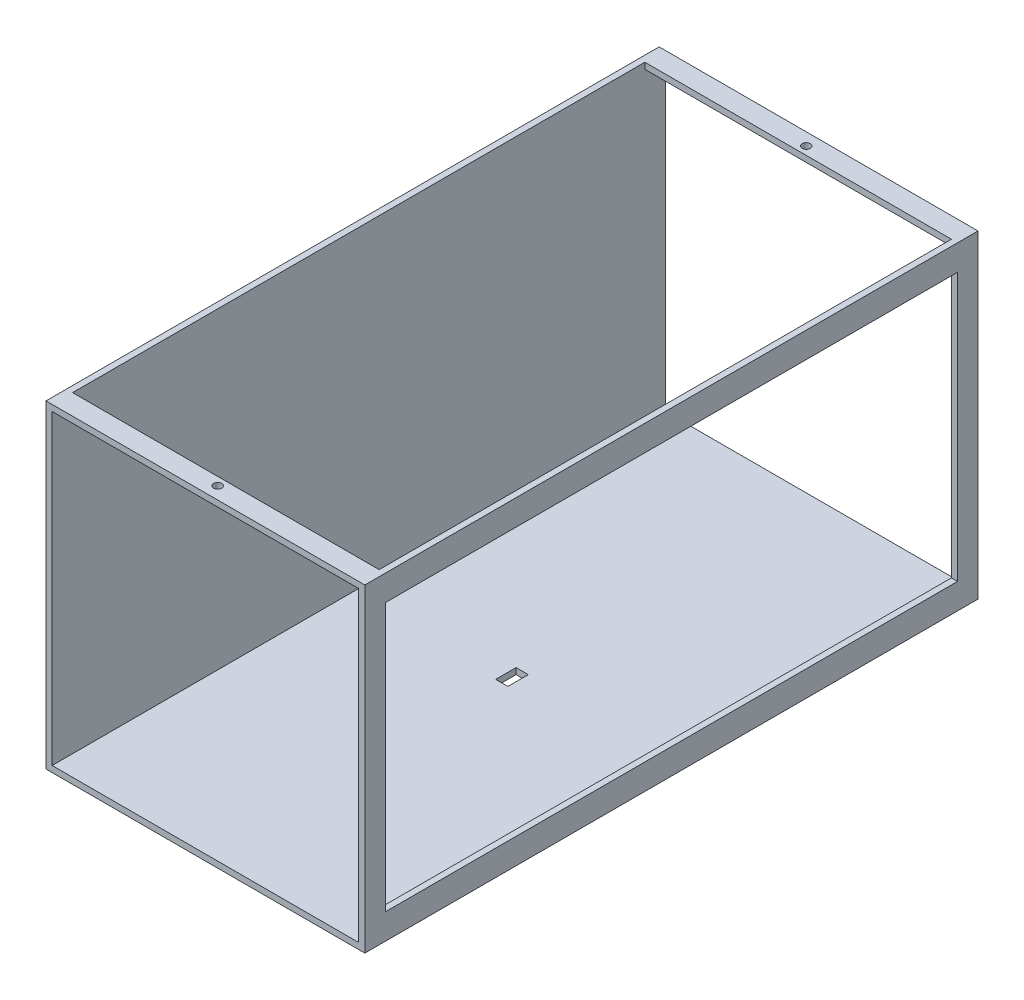
ISO-10303-21;
HEADER;
FILE_DESCRIPTION(('STEP AP214'),'2;1');
FILE_NAME('part.step','',(''),(''),'','','');
FILE_SCHEMA(('AUTOMOTIVE_DESIGN { 1 0 10303 214 1 1 1 1 }'));
ENDSEC;
DATA;
#1=APPLICATION_CONTEXT('core data for automotive mechanical design processes');
#2=APPLICATION_PROTOCOL_DEFINITION('international standard','automotive_design',2000,#1);
#3=PRODUCT_CONTEXT('',#1,'mechanical');
#4=PRODUCT('Part','Part','',(#3));
#5=PRODUCT_RELATED_PRODUCT_CATEGORY('part','',(#4));
#6=PRODUCT_DEFINITION_FORMATION('','',#4);
#7=PRODUCT_DEFINITION_CONTEXT('part definition',#1,'design');
#8=PRODUCT_DEFINITION('design','',#6,#7);
#9=PRODUCT_DEFINITION_SHAPE('','',#8);
#10=(LENGTH_UNIT() NAMED_UNIT(*) SI_UNIT(.MILLI.,.METRE.));
#11=(NAMED_UNIT(*) PLANE_ANGLE_UNIT() SI_UNIT($,.RADIAN.));
#12=(NAMED_UNIT(*) SI_UNIT($,.STERADIAN.) SOLID_ANGLE_UNIT());
#13=UNCERTAINTY_MEASURE_WITH_UNIT(LENGTH_MEASURE(1.E-05),#10,'distance_accuracy_value','');
#14=(GEOMETRIC_REPRESENTATION_CONTEXT(3) GLOBAL_UNCERTAINTY_ASSIGNED_CONTEXT((#13)) GLOBAL_UNIT_ASSIGNED_CONTEXT((#10,
#11,#12)) REPRESENTATION_CONTEXT('',''));
#15=CARTESIAN_POINT('',(0.,0.,0.));
#16=DIRECTION('',(0.,0.,1.));
#17=DIRECTION('',(1.,0.,0.));
#18=AXIS2_PLACEMENT_3D('',#15,#16,#17);
#19=CARTESIAN_POINT('',(75.,75.,300.));
#20=DIRECTION('',(-1.,0.,0.));
#21=DIRECTION('',(0.,-1.,0.));
#22=AXIS2_PLACEMENT_3D('',#19,#20,#21);
#23=PLANE('',#22);
#24=DIRECTION('',(0.,0.,-1.));
#25=VECTOR('',#24,1.);
#26=CARTESIAN_POINT('',(75.,65.5,300.));
#27=LINE('',#26,#25);
#28=CARTESIAN_POINT('',(75.,65.5,290.));
#29=VERTEX_POINT('',#28);
#30=CARTESIAN_POINT('',(75.,65.5,9.99999999999995));
#31=VERTEX_POINT('',#30);
#32=EDGE_CURVE('E411',#29,#31,#27,.T.);
#33=ORIENTED_EDGE('',*,*,#32,.F.);
#34=DIRECTION('',(0.,1.,0.));
#35=VECTOR('',#34,1.);
#36=CARTESIAN_POINT('',(75.,75.,290.));
#37=LINE('',#36,#35);
#38=CARTESIAN_POINT('',(75.,-65.5,290.));
#39=VERTEX_POINT('',#38);
#40=EDGE_CURVE('E414',#39,#29,#37,.T.);
#41=ORIENTED_EDGE('',*,*,#40,.F.);
#42=DIRECTION('',(0.,0.,1.));
#43=VECTOR('',#42,1.);
#44=CARTESIAN_POINT('',(75.,-65.5,300.));
#45=LINE('',#44,#43);
#46=CARTESIAN_POINT('',(75.,-65.5,9.99999999999995));
#47=VERTEX_POINT('',#46);
#48=EDGE_CURVE('E404',#47,#39,#45,.T.);
#49=ORIENTED_EDGE('',*,*,#48,.F.);
#50=DIRECTION('',(0.,-1.,0.));
#51=VECTOR('',#50,1.);
#52=CARTESIAN_POINT('',(75.,75.,9.99999999999995));
#53=LINE('',#52,#51);
#54=EDGE_CURVE('E407',#31,#47,#53,.T.);
#55=ORIENTED_EDGE('',*,*,#54,.F.);
#56=EDGE_LOOP('',(#33,#41,#49,#55));
#57=FACE_BOUND('',#56,.T.);
#58=DIRECTION('',(0.,1.,0.));
#59=VECTOR('',#58,1.);
#60=CARTESIAN_POINT('',(75.,75.,300.));
#61=LINE('',#60,#59);
#62=CARTESIAN_POINT('',(75.,-75.,300.));
#63=VERTEX_POINT('',#62);
#64=CARTESIAN_POINT('',(75.,75.,300.));
#65=VERTEX_POINT('',#64);
#66=EDGE_CURVE('E207',#63,#65,#61,.T.);
#67=ORIENTED_EDGE('',*,*,#66,.T.);
#68=DIRECTION('',(0.,0.,1.));
#69=VECTOR('',#68,1.);
#70=CARTESIAN_POINT('',(75.,75.,-43.0000000000001));
#71=LINE('',#70,#69);
#72=CARTESIAN_POINT('',(75.0000000000001,75.,290.));
#73=VERTEX_POINT('',#72);
#74=EDGE_CURVE('E86',#73,#65,#71,.T.);
#75=ORIENTED_EDGE('',*,*,#74,.F.);
#76=DIRECTION('',(0.,1.,0.));
#77=VECTOR('',#76,1.);
#78=CARTESIAN_POINT('',(75.0000000000001,78.,290.));
#79=LINE('',#78,#77);
#80=CARTESIAN_POINT('',(75.0000000000001,78.,290.));
#81=VERTEX_POINT('',#80);
#82=EDGE_CURVE('E298',#73,#81,#79,.T.);
#83=ORIENTED_EDGE('',*,*,#82,.T.);
#84=DIRECTION('',(0.,0.,-1.));
#85=VECTOR('',#84,1.);
#86=CARTESIAN_POINT('',(75.,78.,300.));
#87=LINE('',#86,#85);
#88=CARTESIAN_POINT('',(75.,78.,9.99999999999995));
#89=VERTEX_POINT('',#88);
#90=EDGE_CURVE('E311',#81,#89,#87,.T.);
#91=ORIENTED_EDGE('',*,*,#90,.T.);
#92=DIRECTION('',(0.,-1.,0.));
#93=VECTOR('',#92,1.);
#94=CARTESIAN_POINT('',(75.0000000000001,65.5,9.99999999999995));
#95=LINE('',#94,#93);
#96=CARTESIAN_POINT('',(75.,75.,9.99999999999995));
#97=VERTEX_POINT('',#96);
#98=EDGE_CURVE('E286',#89,#97,#95,.T.);
#99=ORIENTED_EDGE('',*,*,#98,.T.);
#100=CARTESIAN_POINT('',(75.,75.,0.));
#101=VERTEX_POINT('',#100);
#102=EDGE_CURVE('E225',#101,#97,#71,.T.);
#103=ORIENTED_EDGE('',*,*,#102,.F.);
#104=DIRECTION('',(0.,1.,0.));
#105=VECTOR('',#104,1.);
#106=CARTESIAN_POINT('',(75.,75.,0.));
#107=LINE('',#106,#105);
#108=CARTESIAN_POINT('',(75.,-75.,0.));
#109=VERTEX_POINT('',#108);
#110=EDGE_CURVE('E333',#109,#101,#107,.T.);
#111=ORIENTED_EDGE('',*,*,#110,.F.);
#112=DIRECTION('',(0.,0.,-1.));
#113=VECTOR('',#112,1.);
#114=CARTESIAN_POINT('',(75.,-75.,300.));
#115=LINE('',#114,#113);
#116=EDGE_CURVE('E209',#63,#109,#115,.T.);
#117=ORIENTED_EDGE('',*,*,#116,.F.);
#118=EDGE_LOOP('',(#67,#75,#83,#91,#99,#103,#111,#117));
#119=FACE_BOUND('',#118,.T.);
#120=ADVANCED_FACE('F69',(#57,#119),#23,.T.);
#121=CARTESIAN_POINT('',(-75.,75.,300.));
#122=DIRECTION('',(1.,0.,0.));
#123=DIRECTION('',(0.,1.,0.));
#124=AXIS2_PLACEMENT_3D('',#121,#122,#123);
#125=PLANE('',#124);
#126=DIRECTION('',(0.,0.,1.));
#127=VECTOR('',#126,1.);
#128=CARTESIAN_POINT('',(-75.,75.,-43.0000000000001));
#129=LINE('',#128,#127);
#130=CARTESIAN_POINT('',(-75.,75.,290.));
#131=VERTEX_POINT('',#130);
#132=CARTESIAN_POINT('',(-75.,75.,300.));
#133=VERTEX_POINT('',#132);
#134=EDGE_CURVE('E233',#131,#133,#129,.T.);
#135=ORIENTED_EDGE('',*,*,#134,.T.);
#136=DIRECTION('',(0.,-1.,0.));
#137=VECTOR('',#136,1.);
#138=CARTESIAN_POINT('',(-75.,75.,300.));
#139=LINE('',#138,#137);
#140=CARTESIAN_POINT('',(-75.,-75.,300.));
#141=VERTEX_POINT('',#140);
#142=EDGE_CURVE('E214',#133,#141,#139,.T.);
#143=ORIENTED_EDGE('',*,*,#142,.T.);
#144=DIRECTION('',(0.,0.,-1.));
#145=VECTOR('',#144,1.);
#146=CARTESIAN_POINT('',(-75.,-75.,300.));
#147=LINE('',#146,#145);
#148=CARTESIAN_POINT('',(-75.,-75.,0.));
#149=VERTEX_POINT('',#148);
#150=EDGE_CURVE('E358',#141,#149,#147,.T.);
#151=ORIENTED_EDGE('',*,*,#150,.T.);
#152=DIRECTION('',(0.,-1.,0.));
#153=VECTOR('',#152,1.);
#154=CARTESIAN_POINT('',(-75.,75.,0.));
#155=LINE('',#154,#153);
#156=CARTESIAN_POINT('',(-75.,75.,0.));
#157=VERTEX_POINT('',#156);
#158=EDGE_CURVE('E350',#157,#149,#155,.T.);
#159=ORIENTED_EDGE('',*,*,#158,.F.);
#160=CARTESIAN_POINT('',(-75.,75.,9.99999999999995));
#161=VERTEX_POINT('',#160);
#162=EDGE_CURVE('E235',#157,#161,#129,.T.);
#163=ORIENTED_EDGE('',*,*,#162,.T.);
#164=DIRECTION('',(0.,-1.,0.));
#165=VECTOR('',#164,1.);
#166=CARTESIAN_POINT('',(-75.,65.5,9.99999999999995));
#167=LINE('',#166,#165);
#168=CARTESIAN_POINT('',(-75.,78.,9.99999999999995));
#169=VERTEX_POINT('',#168);
#170=EDGE_CURVE('E285',#169,#161,#167,.T.);
#171=ORIENTED_EDGE('',*,*,#170,.F.);
#172=DIRECTION('',(0.,0.,1.));
#173=VECTOR('',#172,1.);
#174=CARTESIAN_POINT('',(-75.,78.,300.));
#175=LINE('',#174,#173);
#176=CARTESIAN_POINT('',(-75.,78.,290.));
#177=VERTEX_POINT('',#176);
#178=EDGE_CURVE('E307',#169,#177,#175,.T.);
#179=ORIENTED_EDGE('',*,*,#178,.T.);
#180=DIRECTION('',(0.,1.,0.));
#181=VECTOR('',#180,1.);
#182=CARTESIAN_POINT('',(-75.,78.,290.));
#183=LINE('',#182,#181);
#184=EDGE_CURVE('E297',#131,#177,#183,.T.);
#185=ORIENTED_EDGE('',*,*,#184,.F.);
#186=EDGE_LOOP('',(#135,#143,#151,#159,#163,#171,#179,#185));
#187=FACE_BOUND('',#186,.T.);
#188=ADVANCED_FACE('F475',(#187),#125,.T.);
#189=CARTESIAN_POINT('',(0.,0.,300.));
#190=DIRECTION('',(0.,0.,1.));
#191=DIRECTION('',(1.,0.,0.));
#192=AXIS2_PLACEMENT_3D('',#189,#190,#191);
#193=PLANE('',#192);
#194=ORIENTED_EDGE('',*,*,#142,.F.);
#195=DIRECTION('',(-1.,0.,0.));
#196=VECTOR('',#195,1.);
#197=CARTESIAN_POINT('',(-75.,75.,300.));
#198=LINE('',#197,#196);
#199=EDGE_CURVE('E220',#65,#133,#198,.T.);
#200=ORIENTED_EDGE('',*,*,#199,.F.);
#201=ORIENTED_EDGE('',*,*,#66,.F.);
#202=DIRECTION('',(1.,0.,0.));
#203=VECTOR('',#202,1.);
#204=CARTESIAN_POINT('',(-75.,-75.,300.));
#205=LINE('',#204,#203);
#206=EDGE_CURVE('E345',#141,#63,#205,.T.);
#207=ORIENTED_EDGE('',*,*,#206,.F.);
#208=EDGE_LOOP('',(#194,#200,#201,#207));
#209=FACE_BOUND('',#208,.T.);
#210=DIRECTION('',(-1.,0.,0.));
#211=VECTOR('',#210,1.);
#212=CARTESIAN_POINT('',(-75.,78.,300.));
#213=LINE('',#212,#211);
#214=CARTESIAN_POINT('',(78.,78.,300.));
#215=VERTEX_POINT('',#214);
#216=CARTESIAN_POINT('',(-78.,78.,300.));
#217=VERTEX_POINT('',#216);
#218=EDGE_CURVE('E367',#215,#217,#213,.T.);
#219=ORIENTED_EDGE('',*,*,#218,.T.);
#220=DIRECTION('',(0.,-1.,0.));
#221=VECTOR('',#220,1.);
#222=CARTESIAN_POINT('',(-78.,75.,300.));
#223=LINE('',#222,#221);
#224=CARTESIAN_POINT('',(-78.,-78.,300.));
#225=VERTEX_POINT('',#224);
#226=EDGE_CURVE('E371',#217,#225,#223,.T.);
#227=ORIENTED_EDGE('',*,*,#226,.T.);
#228=DIRECTION('',(1.,0.,0.));
#229=VECTOR('',#228,1.);
#230=CARTESIAN_POINT('',(-75.,-78.,300.));
#231=LINE('',#230,#229);
#232=CARTESIAN_POINT('',(78.,-78.,300.));
#233=VERTEX_POINT('',#232);
#234=EDGE_CURVE('E374',#225,#233,#231,.T.);
#235=ORIENTED_EDGE('',*,*,#234,.T.);
#236=DIRECTION('',(0.,1.,0.));
#237=VECTOR('',#236,1.);
#238=CARTESIAN_POINT('',(78.,75.,300.));
#239=LINE('',#238,#237);
#240=EDGE_CURVE('E363',#233,#215,#239,.T.);
#241=ORIENTED_EDGE('',*,*,#240,.T.);
#242=EDGE_LOOP('',(#219,#227,#235,#241));
#243=FACE_BOUND('',#242,.T.);
#244=ADVANCED_FACE('F227',(#209,#243),#193,.T.);
#245=CARTESIAN_POINT('',(0.,0.,0.));
#246=DIRECTION('',(0.,0.,1.));
#247=DIRECTION('',(1.,0.,0.));
#248=AXIS2_PLACEMENT_3D('',#245,#246,#247);
#249=PLANE('',#248);
#250=DIRECTION('',(0.,-1.,0.));
#251=VECTOR('',#250,1.);
#252=CARTESIAN_POINT('',(-78.,75.,0.));
#253=LINE('',#252,#251);
#254=CARTESIAN_POINT('',(-78.,78.,0.));
#255=VERTEX_POINT('',#254);
#256=CARTESIAN_POINT('',(-78.,-78.,0.));
#257=VERTEX_POINT('',#256);
#258=EDGE_CURVE('E384',#255,#257,#253,.T.);
#259=ORIENTED_EDGE('',*,*,#258,.F.);
#260=DIRECTION('',(-1.,0.,0.));
#261=VECTOR('',#260,1.);
#262=CARTESIAN_POINT('',(-75.,78.,0.));
#263=LINE('',#262,#261);
#264=CARTESIAN_POINT('',(78.,78.,0.));
#265=VERTEX_POINT('',#264);
#266=EDGE_CURVE('E381',#265,#255,#263,.T.);
#267=ORIENTED_EDGE('',*,*,#266,.F.);
#268=DIRECTION('',(0.,1.,0.));
#269=VECTOR('',#268,1.);
#270=CARTESIAN_POINT('',(78.,75.,0.));
#271=LINE('',#270,#269);
#272=CARTESIAN_POINT('',(78.,-78.,0.));
#273=VERTEX_POINT('',#272);
#274=EDGE_CURVE('E362',#273,#265,#271,.T.);
#275=ORIENTED_EDGE('',*,*,#274,.F.);
#276=DIRECTION('',(1.,0.,0.));
#277=VECTOR('',#276,1.);
#278=CARTESIAN_POINT('',(-75.,-78.,0.));
#279=LINE('',#278,#277);
#280=EDGE_CURVE('E368',#257,#273,#279,.T.);
#281=ORIENTED_EDGE('',*,*,#280,.F.);
#282=EDGE_LOOP('',(#259,#267,#275,#281));
#283=FACE_BOUND('',#282,.T.);
#284=DIRECTION('',(-1.,0.,0.));
#285=VECTOR('',#284,1.);
#286=CARTESIAN_POINT('',(0.,75.,0.));
#287=LINE('',#286,#285);
#288=EDGE_CURVE('E247',#101,#157,#287,.T.);
#289=ORIENTED_EDGE('',*,*,#288,.T.);
#290=ORIENTED_EDGE('',*,*,#158,.T.);
#291=DIRECTION('',(1.,0.,0.));
#292=VECTOR('',#291,1.);
#293=CARTESIAN_POINT('',(-75.,-75.,0.));
#294=LINE('',#293,#292);
#295=EDGE_CURVE('E215',#149,#109,#294,.T.);
#296=ORIENTED_EDGE('',*,*,#295,.T.);
#297=ORIENTED_EDGE('',*,*,#110,.T.);
#298=EDGE_LOOP('',(#289,#290,#296,#297));
#299=FACE_BOUND('',#298,.T.);
#300=ADVANCED_FACE('F460',(#283,#299),#249,.F.);
#301=CARTESIAN_POINT('',(78.,75.,300.));
#302=DIRECTION('',(-1.,0.,0.));
#303=DIRECTION('',(0.,-1.,0.));
#304=AXIS2_PLACEMENT_3D('',#301,#302,#303);
#305=PLANE('',#304);
#306=DIRECTION('',(0.,0.,-1.));
#307=VECTOR('',#306,1.);
#308=CARTESIAN_POINT('',(78.,-65.5,290.));
#309=LINE('',#308,#307);
#310=CARTESIAN_POINT('',(78.,-65.5,290.));
#311=VERTEX_POINT('',#310);
#312=CARTESIAN_POINT('',(78.,-65.5,9.99999999999995));
#313=VERTEX_POINT('',#312);
#314=EDGE_CURVE('E317',#311,#313,#309,.T.);
#315=ORIENTED_EDGE('',*,*,#314,.F.);
#316=DIRECTION('',(0.,-1.,0.));
#317=VECTOR('',#316,1.);
#318=CARTESIAN_POINT('',(78.,65.5,290.));
#319=LINE('',#318,#317);
#320=CARTESIAN_POINT('',(78.,65.5,290.));
#321=VERTEX_POINT('',#320);
#322=EDGE_CURVE('E314',#321,#311,#319,.T.);
#323=ORIENTED_EDGE('',*,*,#322,.F.);
#324=DIRECTION('',(0.,0.,1.));
#325=VECTOR('',#324,1.);
#326=CARTESIAN_POINT('',(78.,65.5,290.));
#327=LINE('',#326,#325);
#328=CARTESIAN_POINT('',(78.,65.5,9.99999999999995));
#329=VERTEX_POINT('',#328);
#330=EDGE_CURVE('E325',#329,#321,#327,.T.);
#331=ORIENTED_EDGE('',*,*,#330,.F.);
#332=DIRECTION('',(0.,1.,0.));
#333=VECTOR('',#332,1.);
#334=CARTESIAN_POINT('',(78.,65.5,9.99999999999995));
#335=LINE('',#334,#333);
#336=EDGE_CURVE('E321',#313,#329,#335,.T.);
#337=ORIENTED_EDGE('',*,*,#336,.F.);
#338=EDGE_LOOP('',(#315,#323,#331,#337));
#339=FACE_BOUND('',#338,.T.);
#340=ORIENTED_EDGE('',*,*,#274,.T.);
#341=DIRECTION('',(0.,0.,-1.));
#342=VECTOR('',#341,1.);
#343=CARTESIAN_POINT('',(78.,78.,300.));
#344=LINE('',#343,#342);
#345=EDGE_CURVE('E400',#215,#265,#344,.T.);
#346=ORIENTED_EDGE('',*,*,#345,.F.);
#347=ORIENTED_EDGE('',*,*,#240,.F.);
#348=DIRECTION('',(0.,0.,-1.));
#349=VECTOR('',#348,1.);
#350=CARTESIAN_POINT('',(78.,-78.,300.));
#351=LINE('',#350,#349);
#352=EDGE_CURVE('E377',#233,#273,#351,.T.);
#353=ORIENTED_EDGE('',*,*,#352,.T.);
#354=EDGE_LOOP('',(#340,#346,#347,#353));
#355=FACE_BOUND('',#354,.T.);
#356=ADVANCED_FACE('F71',(#339,#355),#305,.F.);
#357=CARTESIAN_POINT('',(-75.,78.,300.));
#358=DIRECTION('',(0.,-1.,0.));
#359=DIRECTION('',(0.,0.,-1.));
#360=AXIS2_PLACEMENT_3D('',#357,#358,#359);
#361=PLANE('',#360);
#362=CARTESIAN_POINT('',(0.,78.,294.));
#363=DIRECTION('',(0.,1.,0.));
#364=DIRECTION('',(0.,0.,1.));
#365=AXIS2_PLACEMENT_3D('',#362,#363,#364);
#366=CIRCLE('',#365,2.);
#367=CARTESIAN_POINT('',(0.,78.,296.));
#368=VERTEX_POINT('',#367);
#369=EDGE_CURVE('E269',#368,#368,#366,.T.);
#370=ORIENTED_EDGE('',*,*,#369,.F.);
#371=EDGE_LOOP('',(#370));
#372=FACE_BOUND('',#371,.T.);
#373=CARTESIAN_POINT('',(0.,78.,6.00000000000001));
#374=DIRECTION('',(0.,-1.,0.));
#375=DIRECTION('',(0.,0.,-1.));
#376=AXIS2_PLACEMENT_3D('',#373,#374,#375);
#377=CIRCLE('',#376,2.);
#378=CARTESIAN_POINT('',(0.,78.,4.00000000000001));
#379=VERTEX_POINT('',#378);
#380=EDGE_CURVE('E281',#379,#379,#377,.T.);
#381=ORIENTED_EDGE('',*,*,#380,.T.);
#382=EDGE_LOOP('',(#381));
#383=FACE_BOUND('',#382,.T.);
#384=DIRECTION('',(-1.,0.,0.));
#385=VECTOR('',#384,1.);
#386=CARTESIAN_POINT('',(75.0000000000001,78.,9.99999999999995));
#387=LINE('',#386,#385);
#388=EDGE_CURVE('E290',#89,#169,#387,.T.);
#389=ORIENTED_EDGE('',*,*,#388,.F.);
#390=ORIENTED_EDGE('',*,*,#90,.F.);
#391=DIRECTION('',(-1.,0.,0.));
#392=VECTOR('',#391,1.);
#393=CARTESIAN_POINT('',(75.0000000000001,78.,290.));
#394=LINE('',#393,#392);
#395=EDGE_CURVE('E301',#81,#177,#394,.T.);
#396=ORIENTED_EDGE('',*,*,#395,.T.);
#397=ORIENTED_EDGE('',*,*,#178,.F.);
#398=EDGE_LOOP('',(#389,#390,#396,#397));
#399=FACE_BOUND('',#398,.T.);
#400=ORIENTED_EDGE('',*,*,#266,.T.);
#401=DIRECTION('',(0.,0.,-1.));
#402=VECTOR('',#401,1.);
#403=CARTESIAN_POINT('',(-78.,78.,300.));
#404=LINE('',#403,#402);
#405=EDGE_CURVE('E396',#217,#255,#404,.T.);
#406=ORIENTED_EDGE('',*,*,#405,.F.);
#407=ORIENTED_EDGE('',*,*,#218,.F.);
#408=ORIENTED_EDGE('',*,*,#345,.T.);
#409=EDGE_LOOP('',(#400,#406,#407,#408));
#410=FACE_BOUND('',#409,.T.);
#411=ADVANCED_FACE('F464',(#372,#383,#399,#410),#361,.F.);
#412=CARTESIAN_POINT('',(-78.,75.,300.));
#413=DIRECTION('',(1.,0.,0.));
#414=DIRECTION('',(0.,1.,0.));
#415=AXIS2_PLACEMENT_3D('',#412,#413,#414);
#416=PLANE('',#415);
#417=ORIENTED_EDGE('',*,*,#258,.T.);
#418=DIRECTION('',(0.,0.,-1.));
#419=VECTOR('',#418,1.);
#420=CARTESIAN_POINT('',(-78.,-78.,300.));
#421=LINE('',#420,#419);
#422=EDGE_CURVE('E392',#225,#257,#421,.T.);
#423=ORIENTED_EDGE('',*,*,#422,.F.);
#424=ORIENTED_EDGE('',*,*,#226,.F.);
#425=ORIENTED_EDGE('',*,*,#405,.T.);
#426=EDGE_LOOP('',(#417,#423,#424,#425));
#427=FACE_BOUND('',#426,.T.);
#428=ADVANCED_FACE('F448',(#427),#416,.F.);
#429=CARTESIAN_POINT('',(-75.,-78.,300.));
#430=DIRECTION('',(0.,1.,0.));
#431=DIRECTION('',(0.,0.,1.));
#432=AXIS2_PLACEMENT_3D('',#429,#430,#431);
#433=PLANE('',#432);
#434=DIRECTION('',(-1.,0.,0.));
#435=VECTOR('',#434,1.);
#436=CARTESIAN_POINT('',(-2.99999999999998,-78.,155.));
#437=LINE('',#436,#435);
#438=CARTESIAN_POINT('',(3.00000000000002,-78.,155.));
#439=VERTEX_POINT('',#438);
#440=CARTESIAN_POINT('',(-2.99999999999998,-78.,155.));
#441=VERTEX_POINT('',#440);
#442=EDGE_CURVE('E253',#439,#441,#437,.T.);
#443=ORIENTED_EDGE('',*,*,#442,.F.);
#444=DIRECTION('',(0.,0.,1.));
#445=VECTOR('',#444,1.);
#446=CARTESIAN_POINT('',(3.00000000000002,-78.,155.));
#447=LINE('',#446,#445);
#448=CARTESIAN_POINT('',(3.00000000000002,-78.,145.));
#449=VERTEX_POINT('',#448);
#450=EDGE_CURVE('E94',#449,#439,#447,.T.);
#451=ORIENTED_EDGE('',*,*,#450,.F.);
#452=DIRECTION('',(1.,0.,0.));
#453=VECTOR('',#452,1.);
#454=CARTESIAN_POINT('',(-2.99999999999998,-78.,145.));
#455=LINE('',#454,#453);
#456=CARTESIAN_POINT('',(-2.99999999999998,-78.,145.));
#457=VERTEX_POINT('',#456);
#458=EDGE_CURVE('E261',#457,#449,#455,.T.);
#459=ORIENTED_EDGE('',*,*,#458,.F.);
#460=DIRECTION('',(0.,0.,-1.));
#461=VECTOR('',#460,1.);
#462=CARTESIAN_POINT('',(-2.99999999999998,-78.,155.));
#463=LINE('',#462,#461);
#464=EDGE_CURVE('E257',#441,#457,#463,.T.);
#465=ORIENTED_EDGE('',*,*,#464,.F.);
#466=EDGE_LOOP('',(#443,#451,#459,#465));
#467=FACE_BOUND('',#466,.T.);
#468=ORIENTED_EDGE('',*,*,#280,.T.);
#469=ORIENTED_EDGE('',*,*,#352,.F.);
#470=ORIENTED_EDGE('',*,*,#234,.F.);
#471=ORIENTED_EDGE('',*,*,#422,.T.);
#472=EDGE_LOOP('',(#468,#469,#470,#471));
#473=FACE_BOUND('',#472,.T.);
#474=ADVANCED_FACE('F445',(#467,#473),#433,.F.);
#475=CARTESIAN_POINT('',(-75.,-75.,300.));
#476=DIRECTION('',(0.,1.,0.));
#477=DIRECTION('',(0.,0.,1.));
#478=AXIS2_PLACEMENT_3D('',#475,#476,#477);
#479=PLANE('',#478);
#480=DIRECTION('',(0.,0.,-1.));
#481=VECTOR('',#480,1.);
#482=CARTESIAN_POINT('',(2.99999999999996,-75.,300.));
#483=LINE('',#482,#481);
#484=CARTESIAN_POINT('',(3.00000000000002,-75.,155.));
#485=VERTEX_POINT('',#484);
#486=CARTESIAN_POINT('',(3.00000000000002,-75.,145.));
#487=VERTEX_POINT('',#486);
#488=EDGE_CURVE('E12',#485,#487,#483,.T.);
#489=ORIENTED_EDGE('',*,*,#488,.F.);
#490=DIRECTION('',(1.,0.,0.));
#491=VECTOR('',#490,1.);
#492=CARTESIAN_POINT('',(-75.,-75.,155.));
#493=LINE('',#492,#491);
#494=CARTESIAN_POINT('',(-2.99999999999998,-75.,155.));
#495=VERTEX_POINT('',#494);
#496=EDGE_CURVE('E417',#495,#485,#493,.T.);
#497=ORIENTED_EDGE('',*,*,#496,.F.);
#498=DIRECTION('',(0.,0.,1.));
#499=VECTOR('',#498,1.);
#500=CARTESIAN_POINT('',(-2.99999999999999,-75.,300.));
#501=LINE('',#500,#499);
#502=CARTESIAN_POINT('',(-2.99999999999998,-75.,145.));
#503=VERTEX_POINT('',#502);
#504=EDGE_CURVE('E420',#503,#495,#501,.T.);
#505=ORIENTED_EDGE('',*,*,#504,.F.);
#506=DIRECTION('',(-1.,0.,0.));
#507=VECTOR('',#506,1.);
#508=CARTESIAN_POINT('',(-75.,-75.,145.));
#509=LINE('',#508,#507);
#510=EDGE_CURVE('E79',#487,#503,#509,.T.);
#511=ORIENTED_EDGE('',*,*,#510,.F.);
#512=EDGE_LOOP('',(#489,#497,#505,#511));
#513=FACE_BOUND('',#512,.T.);
#514=ORIENTED_EDGE('',*,*,#295,.F.);
#515=ORIENTED_EDGE('',*,*,#150,.F.);
#516=ORIENTED_EDGE('',*,*,#206,.T.);
#517=ORIENTED_EDGE('',*,*,#116,.T.);
#518=EDGE_LOOP('',(#514,#515,#516,#517));
#519=FACE_BOUND('',#518,.T.);
#520=ADVANCED_FACE('F438',(#513,#519),#479,.T.);
#521=CARTESIAN_POINT('',(68.,65.5,290.));
#522=DIRECTION('',(0.,0.,1.));
#523=DIRECTION('',(1.,0.,0.));
#524=AXIS2_PLACEMENT_3D('',#521,#522,#523);
#525=PLANE('',#524);
#526=ORIENTED_EDGE('',*,*,#40,.T.);
#527=DIRECTION('',(1.,0.,0.));
#528=VECTOR('',#527,1.);
#529=CARTESIAN_POINT('',(68.,65.5,290.));
#530=LINE('',#529,#528);
#531=EDGE_CURVE('E330',#29,#321,#530,.T.);
#532=ORIENTED_EDGE('',*,*,#531,.T.);
#533=ORIENTED_EDGE('',*,*,#322,.T.);
#534=DIRECTION('',(1.,0.,0.));
#535=VECTOR('',#534,1.);
#536=CARTESIAN_POINT('',(68.,-65.5,290.));
#537=LINE('',#536,#535);
#538=EDGE_CURVE('E329',#39,#311,#537,.T.);
#539=ORIENTED_EDGE('',*,*,#538,.F.);
#540=EDGE_LOOP('',(#526,#532,#533,#539));
#541=FACE_BOUND('',#540,.T.);
#542=ADVANCED_FACE('F507',(#541),#525,.F.);
#543=CARTESIAN_POINT('',(68.,65.5,290.));
#544=DIRECTION('',(0.,1.,0.));
#545=DIRECTION('',(-1.,0.,0.));
#546=AXIS2_PLACEMENT_3D('',#543,#544,#545);
#547=PLANE('',#546);
#548=ORIENTED_EDGE('',*,*,#32,.T.);
#549=DIRECTION('',(1.,0.,0.));
#550=VECTOR('',#549,1.);
#551=CARTESIAN_POINT('',(68.,65.5,9.99999999999995));
#552=LINE('',#551,#550);
#553=EDGE_CURVE('E334',#31,#329,#552,.T.);
#554=ORIENTED_EDGE('',*,*,#553,.T.);
#555=ORIENTED_EDGE('',*,*,#330,.T.);
#556=ORIENTED_EDGE('',*,*,#531,.F.);
#557=EDGE_LOOP('',(#548,#554,#555,#556));
#558=FACE_BOUND('',#557,.T.);
#559=ADVANCED_FACE('F512',(#558),#547,.F.);
#560=CARTESIAN_POINT('',(68.,65.5,9.99999999999995));
#561=DIRECTION('',(0.,0.,-1.));
#562=DIRECTION('',(-1.,0.,0.));
#563=AXIS2_PLACEMENT_3D('',#560,#561,#562);
#564=PLANE('',#563);
#565=ORIENTED_EDGE('',*,*,#54,.T.);
#566=DIRECTION('',(1.,0.,0.));
#567=VECTOR('',#566,1.);
#568=CARTESIAN_POINT('',(68.,-65.5,9.99999999999995));
#569=LINE('',#568,#567);
#570=EDGE_CURVE('E337',#47,#313,#569,.T.);
#571=ORIENTED_EDGE('',*,*,#570,.T.);
#572=ORIENTED_EDGE('',*,*,#336,.T.);
#573=ORIENTED_EDGE('',*,*,#553,.F.);
#574=EDGE_LOOP('',(#565,#571,#572,#573));
#575=FACE_BOUND('',#574,.T.);
#576=ADVANCED_FACE('F514',(#575),#564,.F.);
#577=CARTESIAN_POINT('',(68.,-65.5,290.));
#578=DIRECTION('',(0.,-1.,0.));
#579=DIRECTION('',(1.,0.,0.));
#580=AXIS2_PLACEMENT_3D('',#577,#578,#579);
#581=PLANE('',#580);
#582=ORIENTED_EDGE('',*,*,#48,.T.);
#583=ORIENTED_EDGE('',*,*,#538,.T.);
#584=ORIENTED_EDGE('',*,*,#314,.T.);
#585=ORIENTED_EDGE('',*,*,#570,.F.);
#586=EDGE_LOOP('',(#582,#583,#584,#585));
#587=FACE_BOUND('',#586,.T.);
#588=ADVANCED_FACE('F502',(#587),#581,.F.);
#589=CARTESIAN_POINT('',(75.0000000000001,78.,290.));
#590=DIRECTION('',(0.,0.,1.));
#591=DIRECTION('',(1.,0.,0.));
#592=AXIS2_PLACEMENT_3D('',#589,#590,#591);
#593=PLANE('',#592);
#594=ORIENTED_EDGE('',*,*,#82,.F.);
#595=DIRECTION('',(-1.,0.,0.));
#596=VECTOR('',#595,1.);
#597=CARTESIAN_POINT('',(75.0000000000001,75.,290.));
#598=LINE('',#597,#596);
#599=EDGE_CURVE('E222',#73,#131,#598,.T.);
#600=ORIENTED_EDGE('',*,*,#599,.T.);
#601=ORIENTED_EDGE('',*,*,#184,.T.);
#602=ORIENTED_EDGE('',*,*,#395,.F.);
#603=EDGE_LOOP('',(#594,#600,#601,#602));
#604=FACE_BOUND('',#603,.T.);
#605=ADVANCED_FACE('F521',(#604),#593,.F.);
#606=CARTESIAN_POINT('',(75.0000000000001,65.5,9.99999999999995));
#607=DIRECTION('',(0.,0.,-1.));
#608=DIRECTION('',(-1.,0.,0.));
#609=AXIS2_PLACEMENT_3D('',#606,#607,#608);
#610=PLANE('',#609);
#611=ORIENTED_EDGE('',*,*,#170,.T.);
#612=DIRECTION('',(1.,0.,0.));
#613=VECTOR('',#612,1.);
#614=CARTESIAN_POINT('',(75.0000000000001,75.,9.99999999999995));
#615=LINE('',#614,#613);
#616=EDGE_CURVE('E241',#161,#97,#615,.T.);
#617=ORIENTED_EDGE('',*,*,#616,.T.);
#618=ORIENTED_EDGE('',*,*,#98,.F.);
#619=ORIENTED_EDGE('',*,*,#388,.T.);
#620=EDGE_LOOP('',(#611,#617,#618,#619));
#621=FACE_BOUND('',#620,.T.);
#622=ADVANCED_FACE('F605',(#621),#610,.F.);
#623=CARTESIAN_POINT('',(0.,68.,6.00000000000001));
#624=DIRECTION('',(0.,1.,0.));
#625=DIRECTION('',(0.,0.,1.));
#626=AXIS2_PLACEMENT_3D('',#623,#624,#625);
#627=CYLINDRICAL_SURFACE('',#626,2.);
#628=CARTESIAN_POINT('',(0.,75.,6.00000000000001));
#629=DIRECTION('',(0.,1.,0.));
#630=DIRECTION('',(0.,0.,1.));
#631=AXIS2_PLACEMENT_3D('',#628,#629,#630);
#632=CIRCLE('',#631,2.);
#633=CARTESIAN_POINT('',(0.,75.,8.00000000000001));
#634=VERTEX_POINT('',#633);
#635=EDGE_CURVE('E237',#634,#634,#632,.T.);
#636=ORIENTED_EDGE('',*,*,#635,.F.);
#637=EDGE_LOOP('',(#636));
#638=FACE_BOUND('',#637,.T.);
#639=ORIENTED_EDGE('',*,*,#380,.F.);
#640=EDGE_LOOP('',(#639));
#641=FACE_BOUND('',#640,.T.);
#642=ADVANCED_FACE('F601',(#638,#641),#627,.F.);
#643=CARTESIAN_POINT('',(0.,68.,294.));
#644=DIRECTION('',(0.,1.,0.));
#645=DIRECTION('',(0.,0.,1.));
#646=AXIS2_PLACEMENT_3D('',#643,#644,#645);
#647=CYLINDRICAL_SURFACE('',#646,2.);
#648=CARTESIAN_POINT('',(0.,75.,294.));
#649=DIRECTION('',(0.,1.,0.));
#650=DIRECTION('',(0.,0.,1.));
#651=AXIS2_PLACEMENT_3D('',#648,#649,#650);
#652=CIRCLE('',#651,2.);
#653=CARTESIAN_POINT('',(0.,75.,296.));
#654=VERTEX_POINT('',#653);
#655=EDGE_CURVE('E73',#654,#654,#652,.F.);
#656=ORIENTED_EDGE('',*,*,#655,.T.);
#657=EDGE_LOOP('',(#656));
#658=FACE_BOUND('',#657,.T.);
#659=ORIENTED_EDGE('',*,*,#369,.T.);
#660=EDGE_LOOP('',(#659));
#661=FACE_BOUND('',#660,.T.);
#662=ADVANCED_FACE('F539',(#658,#661),#647,.F.);
#663=CARTESIAN_POINT('',(3.00000000000002,-68.,155.));
#664=DIRECTION('',(1.,0.,0.));
#665=DIRECTION('',(0.,0.,-1.));
#666=AXIS2_PLACEMENT_3D('',#663,#664,#665);
#667=PLANE('',#666);
#668=ORIENTED_EDGE('',*,*,#488,.T.);
#669=DIRECTION('',(0.,-1.,0.));
#670=VECTOR('',#669,1.);
#671=CARTESIAN_POINT('',(3.00000000000002,-68.,145.));
#672=LINE('',#671,#670);
#673=EDGE_CURVE('E266',#487,#449,#672,.T.);
#674=ORIENTED_EDGE('',*,*,#673,.T.);
#675=ORIENTED_EDGE('',*,*,#450,.T.);
#676=DIRECTION('',(0.,-1.,0.));
#677=VECTOR('',#676,1.);
#678=CARTESIAN_POINT('',(3.00000000000002,-68.,155.));
#679=LINE('',#678,#677);
#680=EDGE_CURVE('E265',#485,#439,#679,.T.);
#681=ORIENTED_EDGE('',*,*,#680,.F.);
#682=EDGE_LOOP('',(#668,#674,#675,#681));
#683=FACE_BOUND('',#682,.T.);
#684=ADVANCED_FACE('F443',(#683),#667,.F.);
#685=CARTESIAN_POINT('',(-2.99999999999998,-68.,145.));
#686=DIRECTION('',(0.,0.,-1.));
#687=DIRECTION('',(-1.,0.,0.));
#688=AXIS2_PLACEMENT_3D('',#685,#686,#687);
#689=PLANE('',#688);
#690=ORIENTED_EDGE('',*,*,#510,.T.);
#691=DIRECTION('',(0.,-1.,0.));
#692=VECTOR('',#691,1.);
#693=CARTESIAN_POINT('',(-2.99999999999998,-68.,145.));
#694=LINE('',#693,#692);
#695=EDGE_CURVE('E270',#503,#457,#694,.T.);
#696=ORIENTED_EDGE('',*,*,#695,.T.);
#697=ORIENTED_EDGE('',*,*,#458,.T.);
#698=ORIENTED_EDGE('',*,*,#673,.F.);
#699=EDGE_LOOP('',(#690,#696,#697,#698));
#700=FACE_BOUND('',#699,.T.);
#701=ADVANCED_FACE('F429',(#700),#689,.F.);
#702=CARTESIAN_POINT('',(-2.99999999999998,-68.,155.));
#703=DIRECTION('',(-1.,0.,0.));
#704=DIRECTION('',(0.,0.,1.));
#705=AXIS2_PLACEMENT_3D('',#702,#703,#704);
#706=PLANE('',#705);
#707=ORIENTED_EDGE('',*,*,#504,.T.);
#708=DIRECTION('',(0.,-1.,0.));
#709=VECTOR('',#708,1.);
#710=CARTESIAN_POINT('',(-2.99999999999998,-68.,155.));
#711=LINE('',#710,#709);
#712=EDGE_CURVE('E273',#495,#441,#711,.T.);
#713=ORIENTED_EDGE('',*,*,#712,.T.);
#714=ORIENTED_EDGE('',*,*,#464,.T.);
#715=ORIENTED_EDGE('',*,*,#695,.F.);
#716=EDGE_LOOP('',(#707,#713,#714,#715));
#717=FACE_BOUND('',#716,.T.);
#718=ADVANCED_FACE('F434',(#717),#706,.F.);
#719=CARTESIAN_POINT('',(-2.99999999999998,-68.,155.));
#720=DIRECTION('',(0.,0.,1.));
#721=DIRECTION('',(1.,0.,0.));
#722=AXIS2_PLACEMENT_3D('',#719,#720,#721);
#723=PLANE('',#722);
#724=ORIENTED_EDGE('',*,*,#496,.T.);
#725=ORIENTED_EDGE('',*,*,#680,.T.);
#726=ORIENTED_EDGE('',*,*,#442,.T.);
#727=ORIENTED_EDGE('',*,*,#712,.F.);
#728=EDGE_LOOP('',(#724,#725,#726,#727));
#729=FACE_BOUND('',#728,.T.);
#730=ADVANCED_FACE('F441',(#729),#723,.F.);
#731=CARTESIAN_POINT('',(-75.,75.,-43.0000000000001));
#732=DIRECTION('',(0.,1.,0.));
#733=DIRECTION('',(0.,0.,1.));
#734=AXIS2_PLACEMENT_3D('',#731,#732,#733);
#735=PLANE('',#734);
#736=ORIENTED_EDGE('',*,*,#655,.F.);
#737=EDGE_LOOP('',(#736));
#738=FACE_BOUND('',#737,.T.);
#739=ORIENTED_EDGE('',*,*,#74,.T.);
#740=ORIENTED_EDGE('',*,*,#199,.T.);
#741=ORIENTED_EDGE('',*,*,#134,.F.);
#742=ORIENTED_EDGE('',*,*,#599,.F.);
#743=EDGE_LOOP('',(#739,#740,#741,#742));
#744=FACE_BOUND('',#743,.T.);
#745=ADVANCED_FACE('F219',(#738,#744),#735,.F.);
#746=ORIENTED_EDGE('',*,*,#635,.T.);
#747=EDGE_LOOP('',(#746));
#748=FACE_BOUND('',#747,.T.);
#749=ORIENTED_EDGE('',*,*,#102,.T.);
#750=ORIENTED_EDGE('',*,*,#616,.F.);
#751=ORIENTED_EDGE('',*,*,#162,.F.);
#752=ORIENTED_EDGE('',*,*,#288,.F.);
#753=EDGE_LOOP('',(#749,#750,#751,#752));
#754=FACE_BOUND('',#753,.T.);
#755=ADVANCED_FACE('F585',(#748,#754),#735,.F.);
#756=CLOSED_SHELL('',(#120,#188,#244,#300,#356,#411,#428,#474,#520,#542,#559,#576,#588,#605,
#622,#642,#662,#684,#701,#718,#730,#745,#755));
#757=MANIFOLD_SOLID_BREP('B2',#756);
#758=ADVANCED_BREP_SHAPE_REPRESENTATION('',(#18,#757),#14);
#759=SHAPE_DEFINITION_REPRESENTATION(#9,#758);
ENDSEC;
END-ISO-10303-21;
